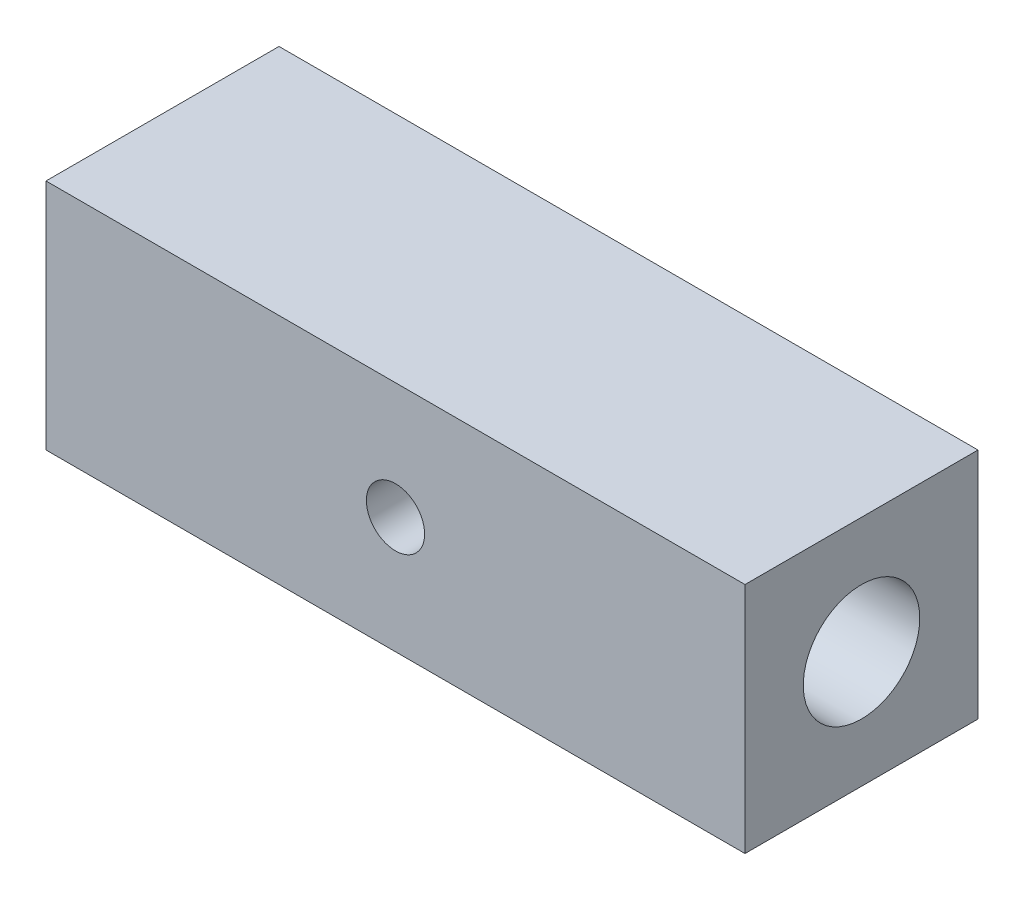
ISO-10303-21;
HEADER;
FILE_DESCRIPTION(('STEP AP214'),'2;1');
FILE_NAME('part.step','',(''),(''),'','','');
FILE_SCHEMA(('AUTOMOTIVE_DESIGN { 1 0 10303 214 1 1 1 1 }'));
ENDSEC;
DATA;
#1=APPLICATION_CONTEXT('core data for automotive mechanical design processes');
#2=APPLICATION_PROTOCOL_DEFINITION('international standard','automotive_design',2000,#1);
#3=PRODUCT_CONTEXT('',#1,'mechanical');
#4=PRODUCT('Part','Part','',(#3));
#5=PRODUCT_RELATED_PRODUCT_CATEGORY('part','',(#4));
#6=PRODUCT_DEFINITION_FORMATION('','',#4);
#7=PRODUCT_DEFINITION_CONTEXT('part definition',#1,'design');
#8=PRODUCT_DEFINITION('design','',#6,#7);
#9=PRODUCT_DEFINITION_SHAPE('','',#8);
#10=(LENGTH_UNIT() NAMED_UNIT(*) SI_UNIT(.MILLI.,.METRE.));
#11=(NAMED_UNIT(*) PLANE_ANGLE_UNIT() SI_UNIT($,.RADIAN.));
#12=(NAMED_UNIT(*) SI_UNIT($,.STERADIAN.) SOLID_ANGLE_UNIT());
#13=UNCERTAINTY_MEASURE_WITH_UNIT(LENGTH_MEASURE(1.E-05),#10,'distance_accuracy_value','');
#14=(GEOMETRIC_REPRESENTATION_CONTEXT(3) GLOBAL_UNCERTAINTY_ASSIGNED_CONTEXT((#13)) GLOBAL_UNIT_ASSIGNED_CONTEXT((#10,
#11,#12)) REPRESENTATION_CONTEXT('',''));
#15=CARTESIAN_POINT('',(0.,0.,0.));
#16=DIRECTION('',(0.,0.,1.));
#17=DIRECTION('',(1.,0.,0.));
#18=AXIS2_PLACEMENT_3D('',#15,#16,#17);
#19=CARTESIAN_POINT('',(-38.1,12.7,25.4));
#20=DIRECTION('',(0.,0.,-1.));
#21=DIRECTION('',(-1.,0.,0.));
#22=AXIS2_PLACEMENT_3D('',#19,#20,#21);
#23=CYLINDRICAL_SURFACE('',#22,3.175);
#24=CARTESIAN_POINT('',(-41.275,12.7,19.05));
#25=CARTESIAN_POINT('',(-41.2749991122824,12.6165030779405,19.0499993116644));
#26=CARTESIAN_POINT('',(-41.2717001255541,12.53299734442,19.048347589117));
#27=CARTESIAN_POINT('',(-41.2585541254501,12.3666216697412,19.0417910582171));
#28=CARTESIAN_POINT('',(-41.2487042634742,12.2837520210442,19.0368848346711));
#29=CARTESIAN_POINT('',(-41.209427934954,12.036817969353,19.0174242674832));
#30=CARTESIAN_POINT('',(-41.1702749225986,11.8745498532384,18.9981282729942));
#31=CARTESIAN_POINT('',(-41.0680092887059,11.5603487109957,18.9489182313574));
#32=CARTESIAN_POINT('',(-41.0049897807566,11.4083781918813,18.9190454778682));
#33=CARTESIAN_POINT('',(-40.8572639263711,11.1173596496212,18.8514281204164));
#34=CARTESIAN_POINT('',(-40.7725592898491,10.9783106087698,18.8136841371588));
#35=CARTESIAN_POINT('',(-40.5780303702658,10.7076589115183,18.7311109618298));
#36=CARTESIAN_POINT('',(-40.4669964222061,10.5770156609991,18.6859912727082));
#37=CARTESIAN_POINT('',(-40.2256033164272,10.3353293093015,18.5947053559106));
#38=CARTESIAN_POINT('',(-40.0952295702336,10.2243011439868,18.5485383606904));
#39=CARTESIAN_POINT('',(-39.8065790522467,10.0163115150211,18.4562363493446));
#40=CARTESIAN_POINT('',(-39.6469224686984,9.92110864838066,18.4103814617679));
#41=CARTESIAN_POINT('',(-39.3954520128256,9.79980650048466,18.3491975928636));
#42=CARTESIAN_POINT('',(-39.3095999381713,9.76294733883109,18.3300642080593));
#43=CARTESIAN_POINT('',(-39.1344143862936,9.69677491260394,18.2950460485327));
#44=CARTESIAN_POINT('',(-39.0450830018195,9.66745719027842,18.2791593558343));
#45=CARTESIAN_POINT('',(-38.8689894480353,9.61825736707018,18.2521261163505));
#46=CARTESIAN_POINT('',(-38.7823892059714,9.59791871888022,18.2407542913775));
#47=CARTESIAN_POINT('',(-38.6074127210056,9.56454399639235,18.2219365488644));
#48=CARTESIAN_POINT('',(-38.5190374462283,9.55150404762743,18.2144885485114));
#49=CARTESIAN_POINT('',(-38.3412932611514,9.5329228694656,18.2038387578292));
#50=CARTESIAN_POINT('',(-38.2519249820126,9.52737712400351,18.2006344102652));
#51=CARTESIAN_POINT('',(-38.0730192158219,9.52385221193007,18.1985978839861));
#52=CARTESIAN_POINT('',(-37.9834817457287,9.52587232340128,18.199765288128));
#53=CARTESIAN_POINT('',(-37.7372521242756,9.5418806966974,18.2089919036273));
#54=CARTESIAN_POINT('',(-37.5811582701866,9.56378746547035,18.2216085735771));
#55=CARTESIAN_POINT('',(-37.2753533586935,9.62996253627833,18.2586649305282));
#56=CARTESIAN_POINT('',(-37.1256443509773,9.67423796145496,18.2831083835808));
#57=CARTESIAN_POINT('',(-36.8324557034359,9.78468490166353,18.3415788540724));
#58=CARTESIAN_POINT('',(-36.6892023900634,9.85134241870582,18.3758158387613));
#59=CARTESIAN_POINT('',(-36.415233913826,10.0042923847395,18.4500326880763));
#60=CARTESIAN_POINT('',(-36.2845244203915,10.0905936532537,18.490015129278));
#61=CARTESIAN_POINT('',(-36.0218957257497,10.2931403575043,18.5773428901861));
#62=CARTESIAN_POINT('',(-35.8919246151435,10.4117951166475,18.6249789840394));
#63=CARTESIAN_POINT('',(-35.6529148571362,10.6694110155157,18.718137005749));
#64=CARTESIAN_POINT('',(-35.5438862136413,10.8083818043645,18.7636579153816));
#65=CARTESIAN_POINT('',(-35.3450980802803,11.1108601002752,18.8500381059768));
#66=CARTESIAN_POINT('',(-35.2564685144201,11.2752073483521,18.8905827497457));
#67=CARTESIAN_POINT('',(-35.1088419183647,11.6190197641442,18.9597627229995));
#68=CARTESIAN_POINT('',(-35.0498213588683,11.7984727949261,18.9884075057895));
#69=CARTESIAN_POINT('',(-34.967940596601,12.1514663893732,19.0285475969036));
#70=CARTESIAN_POINT('',(-34.9424903274127,12.3242656406148,19.04126679123));
#71=CARTESIAN_POINT('',(-34.9203494777398,12.6721247700552,19.0523181771632));
#72=CARTESIAN_POINT('',(-34.9236452728607,12.84718353806,19.0506571843613));
#73=CARTESIAN_POINT('',(-34.9574062359454,13.1801646860804,19.033845354084));
#74=CARTESIAN_POINT('',(-34.9857457914749,13.3383636205642,19.0197500506043));
#75=CARTESIAN_POINT('',(-35.0654558782099,13.647441883053,18.9808539392412));
#76=CARTESIAN_POINT('',(-35.1168289484773,13.7983204020714,18.9560519511351));
#77=CARTESIAN_POINT('',(-35.2424951309378,14.0934713318251,18.8970999823633));
#78=CARTESIAN_POINT('',(-35.3174015841112,14.2374315104782,18.8627029961072));
#79=CARTESIAN_POINT('',(-35.4873164256859,14.5112148234104,18.7878711846566));
#80=CARTESIAN_POINT('',(-35.5823333773854,14.6410318995993,18.7474337895468));
#81=CARTESIAN_POINT('',(-35.8005393503738,14.8963624134268,18.6597360270994));
#82=CARTESIAN_POINT('',(-35.9255786071116,15.0202013468198,18.612195592511));
#83=CARTESIAN_POINT('',(-36.1947623551498,15.2458938191887,18.5185809323137));
#84=CARTESIAN_POINT('',(-36.338919952381,15.3477321493525,18.4725077396355));
#85=CARTESIAN_POINT('',(-36.6510686019584,15.5311726287672,18.3848753528874));
#86=CARTESIAN_POINT('',(-36.8198757695104,15.6115559499801,18.3436428144182));
#87=CARTESIAN_POINT('',(-37.1713444648897,15.7419129715294,18.2744767953732));
#88=CARTESIAN_POINT('',(-37.3539877978474,15.7919258549222,18.2465261890087));
#89=CARTESIAN_POINT('',(-37.7091899564702,15.8555108603792,18.210577657146));
#90=CARTESIAN_POINT('',(-37.8810337504072,15.8721202730971,18.2009219234324));
#91=CARTESIAN_POINT('',(-38.2252444424952,15.8771880556388,18.1980000114536));
#92=CARTESIAN_POINT('',(-38.3976110815426,15.8656586276839,18.2047267290444));
#93=CARTESIAN_POINT('',(-38.7206601030739,15.8176154807366,18.2320521147778));
#94=CARTESIAN_POINT('',(-38.8718439417312,15.7835865120769,18.2512682307627));
#95=CARTESIAN_POINT('',(-39.1661908301672,15.6945816482881,18.2997797830258));
#96=CARTESIAN_POINT('',(-39.3093512828503,15.63959901506,18.3290784612733));
#97=CARTESIAN_POINT('',(-39.5942336994286,15.5061154442137,18.3968557633717));
#98=CARTESIAN_POINT('',(-39.7352128093657,15.4262826050393,18.4358188948053));
#99=CARTESIAN_POINT('',(-40.0026974317231,15.2468275915658,18.5177220708238));
#100=CARTESIAN_POINT('',(-40.1291953599427,15.1471951216993,18.5606641782013));
#101=CARTESIAN_POINT('',(-40.3800975241771,14.9168028766122,18.651927537612));
#102=CARTESIAN_POINT('',(-40.5023797564128,14.7837318855871,18.7002683987735));
#103=CARTESIAN_POINT('',(-40.7233978732331,14.4975126512524,18.7921234557675));
#104=CARTESIAN_POINT('',(-40.8221210659827,14.3443536545743,18.8356350432304));
#105=CARTESIAN_POINT('',(-40.9502802661971,14.1017871570449,18.8939107319024));
#106=CARTESIAN_POINT('',(-40.9898005836814,14.0184220003092,18.9122317327138));
#107=CARTESIAN_POINT('',(-41.0615994748237,13.8480770102167,18.945953634756));
#108=CARTESIAN_POINT('',(-41.0938816065344,13.7610989778631,18.961355970127));
#109=CARTESIAN_POINT('',(-41.150759345915,13.5843613228131,18.9887509711198));
#110=CARTESIAN_POINT('',(-41.1753717181381,13.4946082449706,19.0007510680948));
#111=CARTESIAN_POINT('',(-41.2166673895299,13.3129256615916,19.021009835719));
#112=CARTESIAN_POINT('',(-41.2333555321935,13.2209975216803,19.0292707916836));
#113=CARTESIAN_POINT('',(-41.2556162848624,13.0575313475244,19.0403250326333));
#114=CARTESIAN_POINT('',(-41.2628788212497,12.9862740464886,19.0439467081289));
#115=CARTESIAN_POINT('',(-41.2725711265376,12.8433466689413,19.0487845204557));
#116=CARTESIAN_POINT('',(-41.2750007620468,12.7716765810914,19.0500005908905));
#117=CARTESIAN_POINT('',(-41.275,12.7,19.05));
#118=B_SPLINE_CURVE_WITH_KNOTS('',3,(#24,#25,#26,#27,#28,#29,#30,#31,#32,#33,#34,#35,#36,#37,
#38,#39,#40,#41,#42,#43,#44,#45,#46,#47,#48,#49,#50,#51,#52,#53,#54,#55,#56,#57,#58,#59,#60,#61,
#62,#63,#64,#65,#66,#67,#68,#69,#70,#71,#72,#73,#74,#75,#76,#77,#78,#79,#80,#81,#82,#83,#84,#85,
#86,#87,#88,#89,#90,#91,#92,#93,#94,#95,#96,#97,#98,#99,#100,#101,#102,#103,#104,#105,#106,#107,
#108,#109,#110,#111,#112,#113,#114,#115,#116,#117),.UNSPECIFIED.,.T.,.F.,(4,2,2,2,2,2,2,2,2,2,2,
2,2,2,2,2,2,2,2,2,2,2,2,2,2,2,2,2,2,2,2,2,2,2,2,2,2,2,2,2,2,2,2,2,2,2,4),(0.,0.250415612102678,
0.500940186864014,1.00234854488129,1.50182051324263,2.00125310940106,2.53090025348452,
3.06094897410615,3.63210298373098,3.91787290005988,4.20347350732849,4.47213270490102,
4.74064915090148,5.00900371453886,5.27733267302575,5.74927594687738,6.22136960256845,
6.70445970327763,7.1877671279402,7.73235646527879,8.27720530143645,8.84735553323665,
9.41705196489303,9.93956405039338,10.4618285011675,10.9436138594975,11.4254523397102,
11.9210677568139,12.4168946391879,12.9614122158798,13.5063050164601,14.0775857365549,
14.6481278321882,15.1639000911419,15.6794487286237,16.1458838633213,16.6124691169503,
17.1104020806943,17.6085946442304,18.1673210354482,18.7263477502426,19.0082017078365,
19.2899168101042,19.5710117490933,19.8519346536844,20.0668939492147,20.2818591776892),.UNSPECIFIED.);
#119=CARTESIAN_POINT('',(-41.275,12.7,19.05));
#120=VERTEX_POINT('',#119);
#121=EDGE_CURVE('E36',#120,#120,#118,.T.);
#122=ORIENTED_EDGE('',*,*,#121,.F.);
#123=EDGE_LOOP('',(#122));
#124=FACE_BOUND('',#123,.T.);
#125=CARTESIAN_POINT('',(-38.1,12.7,25.4));
#126=DIRECTION('',(0.,0.,1.));
#127=DIRECTION('',(1.,0.,0.));
#128=AXIS2_PLACEMENT_3D('',#125,#126,#127);
#129=CIRCLE('',#128,3.175);
#130=CARTESIAN_POINT('',(-34.925,12.7,25.4));
#131=VERTEX_POINT('',#130);
#132=EDGE_CURVE('E107',#131,#131,#129,.T.);
#133=ORIENTED_EDGE('',*,*,#132,.T.);
#134=EDGE_LOOP('',(#133));
#135=FACE_BOUND('',#134,.T.);
#136=ADVANCED_FACE('F32',(#124,#135),#23,.F.);
#137=CARTESIAN_POINT('',(0.,0.,25.4));
#138=DIRECTION('',(0.,0.,1.));
#139=DIRECTION('',(1.,0.,0.));
#140=AXIS2_PLACEMENT_3D('',#137,#138,#139);
#141=PLANE('',#140);
#142=DIRECTION('',(0.,-1.,0.));
#143=VECTOR('',#142,1.);
#144=CARTESIAN_POINT('',(-76.2,25.4,25.4));
#145=LINE('',#144,#143);
#146=CARTESIAN_POINT('',(-76.2,25.4,25.4));
#147=VERTEX_POINT('',#146);
#148=CARTESIAN_POINT('',(-76.2,0.,25.4));
#149=VERTEX_POINT('',#148);
#150=EDGE_CURVE('E91',#147,#149,#145,.T.);
#151=ORIENTED_EDGE('',*,*,#150,.T.);
#152=DIRECTION('',(1.,0.,0.));
#153=VECTOR('',#152,1.);
#154=CARTESIAN_POINT('',(-76.2,0.,25.4));
#155=LINE('',#154,#153);
#156=CARTESIAN_POINT('',(0.,0.,25.4));
#157=VERTEX_POINT('',#156);
#158=EDGE_CURVE('E85',#149,#157,#155,.T.);
#159=ORIENTED_EDGE('',*,*,#158,.T.);
#160=DIRECTION('',(0.,1.,0.));
#161=VECTOR('',#160,1.);
#162=CARTESIAN_POINT('',(0.,25.4,25.4));
#163=LINE('',#162,#161);
#164=CARTESIAN_POINT('',(0.,25.4,25.4));
#165=VERTEX_POINT('',#164);
#166=EDGE_CURVE('E89',#157,#165,#163,.T.);
#167=ORIENTED_EDGE('',*,*,#166,.T.);
#168=DIRECTION('',(-1.,0.,0.));
#169=VECTOR('',#168,1.);
#170=CARTESIAN_POINT('',(-76.2,25.4,25.4));
#171=LINE('',#170,#169);
#172=EDGE_CURVE('E55',#165,#147,#171,.T.);
#173=ORIENTED_EDGE('',*,*,#172,.T.);
#174=EDGE_LOOP('',(#151,#159,#167,#173));
#175=FACE_BOUND('',#174,.T.);
#176=ORIENTED_EDGE('',*,*,#132,.F.);
#177=EDGE_LOOP('',(#176));
#178=FACE_BOUND('',#177,.T.);
#179=ADVANCED_FACE('F86',(#175,#178),#141,.T.);
#180=CARTESIAN_POINT('',(0.,0.,0.));
#181=DIRECTION('',(0.,0.,1.));
#182=DIRECTION('',(1.,0.,0.));
#183=AXIS2_PLACEMENT_3D('',#180,#181,#182);
#184=PLANE('',#183);
#185=DIRECTION('',(0.,-1.,0.));
#186=VECTOR('',#185,1.);
#187=CARTESIAN_POINT('',(-76.2,25.4,0.));
#188=LINE('',#187,#186);
#189=CARTESIAN_POINT('',(-76.2,25.4,0.));
#190=VERTEX_POINT('',#189);
#191=CARTESIAN_POINT('',(-76.2,0.,0.));
#192=VERTEX_POINT('',#191);
#193=EDGE_CURVE('E104',#190,#192,#188,.T.);
#194=ORIENTED_EDGE('',*,*,#193,.F.);
#195=DIRECTION('',(-1.,0.,0.));
#196=VECTOR('',#195,1.);
#197=CARTESIAN_POINT('',(-76.2,25.4,0.));
#198=LINE('',#197,#196);
#199=CARTESIAN_POINT('',(0.,25.4,0.));
#200=VERTEX_POINT('',#199);
#201=EDGE_CURVE('E78',#200,#190,#198,.T.);
#202=ORIENTED_EDGE('',*,*,#201,.F.);
#203=DIRECTION('',(0.,1.,0.));
#204=VECTOR('',#203,1.);
#205=CARTESIAN_POINT('',(0.,25.4,0.));
#206=LINE('',#205,#204);
#207=CARTESIAN_POINT('',(0.,0.,0.));
#208=VERTEX_POINT('',#207);
#209=EDGE_CURVE('E72',#208,#200,#206,.T.);
#210=ORIENTED_EDGE('',*,*,#209,.F.);
#211=DIRECTION('',(1.,0.,0.));
#212=VECTOR('',#211,1.);
#213=CARTESIAN_POINT('',(-76.2,0.,0.));
#214=LINE('',#213,#212);
#215=EDGE_CURVE('E95',#192,#208,#214,.T.);
#216=ORIENTED_EDGE('',*,*,#215,.F.);
#217=EDGE_LOOP('',(#194,#202,#210,#216));
#218=FACE_BOUND('',#217,.T.);
#219=CARTESIAN_POINT('',(-38.1,12.7,0.));
#220=DIRECTION('',(0.,0.,1.));
#221=DIRECTION('',(1.,0.,0.));
#222=AXIS2_PLACEMENT_3D('',#219,#220,#221);
#223=CIRCLE('',#222,3.175);
#224=CARTESIAN_POINT('',(-34.925,12.7,0.));
#225=VERTEX_POINT('',#224);
#226=EDGE_CURVE('E142',#225,#225,#223,.T.);
#227=ORIENTED_EDGE('',*,*,#226,.T.);
#228=EDGE_LOOP('',(#227));
#229=FACE_BOUND('',#228,.T.);
#230=ADVANCED_FACE('F137',(#218,#229),#184,.F.);
#231=CARTESIAN_POINT('',(-76.2,25.4,25.4));
#232=DIRECTION('',(1.,0.,0.));
#233=DIRECTION('',(0.,1.,0.));
#234=AXIS2_PLACEMENT_3D('',#231,#232,#233);
#235=PLANE('',#234);
#236=CARTESIAN_POINT('',(-76.2,12.7,12.7));
#237=DIRECTION('',(1.,0.,0.));
#238=DIRECTION('',(0.,0.,-1.));
#239=AXIS2_PLACEMENT_3D('',#236,#237,#238);
#240=CIRCLE('',#239,6.35);
#241=CARTESIAN_POINT('',(-76.2,12.7,6.35));
#242=VERTEX_POINT('',#241);
#243=EDGE_CURVE('E116',#242,#242,#240,.T.);
#244=ORIENTED_EDGE('',*,*,#243,.T.);
#245=EDGE_LOOP('',(#244));
#246=FACE_BOUND('',#245,.T.);
#247=ORIENTED_EDGE('',*,*,#193,.T.);
#248=DIRECTION('',(0.,0.,-1.));
#249=VECTOR('',#248,1.);
#250=CARTESIAN_POINT('',(-76.2,0.,25.4));
#251=LINE('',#250,#249);
#252=EDGE_CURVE('E11',#149,#192,#251,.T.);
#253=ORIENTED_EDGE('',*,*,#252,.F.);
#254=ORIENTED_EDGE('',*,*,#150,.F.);
#255=DIRECTION('',(0.,0.,-1.));
#256=VECTOR('',#255,1.);
#257=CARTESIAN_POINT('',(-76.2,25.4,25.4));
#258=LINE('',#257,#256);
#259=EDGE_CURVE('E100',#147,#190,#258,.T.);
#260=ORIENTED_EDGE('',*,*,#259,.T.);
#261=EDGE_LOOP('',(#247,#253,#254,#260));
#262=FACE_BOUND('',#261,.T.);
#263=ADVANCED_FACE('F34',(#246,#262),#235,.F.);
#264=CARTESIAN_POINT('',(-76.2,0.,25.4));
#265=DIRECTION('',(0.,1.,0.));
#266=DIRECTION('',(0.,0.,1.));
#267=AXIS2_PLACEMENT_3D('',#264,#265,#266);
#268=PLANE('',#267);
#269=ORIENTED_EDGE('',*,*,#215,.T.);
#270=DIRECTION('',(0.,0.,-1.));
#271=VECTOR('',#270,1.);
#272=CARTESIAN_POINT('',(0.,0.,25.4));
#273=LINE('',#272,#271);
#274=EDGE_CURVE('E46',#157,#208,#273,.T.);
#275=ORIENTED_EDGE('',*,*,#274,.F.);
#276=ORIENTED_EDGE('',*,*,#158,.F.);
#277=ORIENTED_EDGE('',*,*,#252,.T.);
#278=EDGE_LOOP('',(#269,#275,#276,#277));
#279=FACE_BOUND('',#278,.T.);
#280=ADVANCED_FACE('F94',(#279),#268,.F.);
#281=CARTESIAN_POINT('',(0.,25.4,25.4));
#282=DIRECTION('',(-1.,0.,0.));
#283=DIRECTION('',(0.,0.,1.));
#284=AXIS2_PLACEMENT_3D('',#281,#282,#283);
#285=PLANE('',#284);
#286=CARTESIAN_POINT('',(0.,12.7,12.7));
#287=DIRECTION('',(1.,0.,0.));
#288=DIRECTION('',(0.,0.,-1.));
#289=AXIS2_PLACEMENT_3D('',#286,#287,#288);
#290=CIRCLE('',#289,6.35);
#291=CARTESIAN_POINT('',(0.,12.7,6.35));
#292=VERTEX_POINT('',#291);
#293=EDGE_CURVE('E147',#292,#292,#290,.T.);
#294=ORIENTED_EDGE('',*,*,#293,.F.);
#295=EDGE_LOOP('',(#294));
#296=FACE_BOUND('',#295,.T.);
#297=ORIENTED_EDGE('',*,*,#209,.T.);
#298=DIRECTION('',(0.,0.,-1.));
#299=VECTOR('',#298,1.);
#300=CARTESIAN_POINT('',(0.,25.4,25.4));
#301=LINE('',#300,#299);
#302=EDGE_CURVE('E96',#165,#200,#301,.T.);
#303=ORIENTED_EDGE('',*,*,#302,.F.);
#304=ORIENTED_EDGE('',*,*,#166,.F.);
#305=ORIENTED_EDGE('',*,*,#274,.T.);
#306=EDGE_LOOP('',(#297,#303,#304,#305));
#307=FACE_BOUND('',#306,.T.);
#308=ADVANCED_FACE('F98',(#296,#307),#285,.F.);
#309=CARTESIAN_POINT('',(-76.2,25.4,25.4));
#310=DIRECTION('',(0.,-1.,0.));
#311=DIRECTION('',(0.,0.,-1.));
#312=AXIS2_PLACEMENT_3D('',#309,#310,#311);
#313=PLANE('',#312);
#314=ORIENTED_EDGE('',*,*,#201,.T.);
#315=ORIENTED_EDGE('',*,*,#259,.F.);
#316=ORIENTED_EDGE('',*,*,#172,.F.);
#317=ORIENTED_EDGE('',*,*,#302,.T.);
#318=EDGE_LOOP('',(#314,#315,#316,#317));
#319=FACE_BOUND('',#318,.T.);
#320=ADVANCED_FACE('F128',(#319),#313,.F.);
#321=CARTESIAN_POINT('',(-41.275,12.7,6.35));
#322=CARTESIAN_POINT('',(-41.2749991122824,12.7834969220595,6.35000068833556));
#323=CARTESIAN_POINT('',(-41.2717001255541,12.86700265558,6.35165241088299));
#324=CARTESIAN_POINT('',(-41.2585541254501,13.0333783302588,6.35820894178285));
#325=CARTESIAN_POINT('',(-41.2487042634742,13.1162479789558,6.36311516532887));
#326=CARTESIAN_POINT('',(-41.209427934954,13.363182030647,6.38257573251675));
#327=CARTESIAN_POINT('',(-41.1702749225986,13.5254501467616,6.40187172700575));
#328=CARTESIAN_POINT('',(-41.0680092887059,13.8396512890043,6.4510817686426));
#329=CARTESIAN_POINT('',(-41.0049897807566,13.9916218081187,6.48095452213175));
#330=CARTESIAN_POINT('',(-40.8572639263711,14.2826403503788,6.54857187958363));
#331=CARTESIAN_POINT('',(-40.7725592898491,14.4216893912302,6.58631586284123));
#332=CARTESIAN_POINT('',(-40.5780303702658,14.6923410884817,6.66888903817018));
#333=CARTESIAN_POINT('',(-40.4669964222061,14.8229843390009,6.71400872729182));
#334=CARTESIAN_POINT('',(-40.2256033164272,15.0646706906985,6.80529464408944));
#335=CARTESIAN_POINT('',(-40.0952295702336,15.1756988560132,6.85146163930957));
#336=CARTESIAN_POINT('',(-39.8065790522467,15.3836884849789,6.94376365065536));
#337=CARTESIAN_POINT('',(-39.6469224686984,15.4788913516193,6.98961853823212));
#338=CARTESIAN_POINT('',(-39.3954520128256,15.6001934995153,7.05080240713637));
#339=CARTESIAN_POINT('',(-39.3095999381713,15.6370526611689,7.06993579194067));
#340=CARTESIAN_POINT('',(-39.1344143862936,15.7032250873961,7.10495395146732));
#341=CARTESIAN_POINT('',(-39.0450830018195,15.7325428097216,7.12084064416571));
#342=CARTESIAN_POINT('',(-38.8689894480353,15.7817426329298,7.14787388364951));
#343=CARTESIAN_POINT('',(-38.7823892059715,15.8020812811198,7.15924570862254));
#344=CARTESIAN_POINT('',(-38.6074127210056,15.8354560036076,7.17806345113556));
#345=CARTESIAN_POINT('',(-38.5190374462283,15.8484959523726,7.18551145148865));
#346=CARTESIAN_POINT('',(-38.3412932611514,15.8670771305344,7.19616124217081));
#347=CARTESIAN_POINT('',(-38.2519249820126,15.8726228759965,7.19936558973478));
#348=CARTESIAN_POINT('',(-38.0730192158219,15.8761477880699,7.20140211601391));
#349=CARTESIAN_POINT('',(-37.9834817457287,15.8741276765987,7.20023471187201));
#350=CARTESIAN_POINT('',(-37.7372521242756,15.8581193033026,7.19100809637267));
#351=CARTESIAN_POINT('',(-37.5811582701866,15.8362125345296,7.17839142642293));
#352=CARTESIAN_POINT('',(-37.2753533586935,15.7700374637217,7.14133506947175));
#353=CARTESIAN_POINT('',(-37.1256443509772,15.725762038545,7.11689161641923));
#354=CARTESIAN_POINT('',(-36.8324557034359,15.6153150983365,7.05842114592763));
#355=CARTESIAN_POINT('',(-36.6892023900634,15.5486575812942,7.02418416123871));
#356=CARTESIAN_POINT('',(-36.415233913826,15.3957076152605,6.94996731192367));
#357=CARTESIAN_POINT('',(-36.2845244203915,15.3094063467463,6.90998487072196));
#358=CARTESIAN_POINT('',(-36.0218957257497,15.1068596424956,6.82265710981389));
#359=CARTESIAN_POINT('',(-35.8919246151435,14.9882048833525,6.77502101596064));
#360=CARTESIAN_POINT('',(-35.6529148571362,14.7305889844843,6.68186299425095));
#361=CARTESIAN_POINT('',(-35.5438862136413,14.5916181956355,6.63634208461842));
#362=CARTESIAN_POINT('',(-35.3450980802803,14.2891398997248,6.5499618940232));
#363=CARTESIAN_POINT('',(-35.2564685144201,14.1247926516479,6.50941725025428));
#364=CARTESIAN_POINT('',(-35.1088419183647,13.7809802358558,6.44023727700048));
#365=CARTESIAN_POINT('',(-35.0498213588683,13.6015272050739,6.41159249421054));
#366=CARTESIAN_POINT('',(-34.967940596601,13.2485336106268,6.37145240309642));
#367=CARTESIAN_POINT('',(-34.9424903274127,13.0757343593852,6.35873320877005));
#368=CARTESIAN_POINT('',(-34.9203494777398,12.7278752299448,6.34768182283675));
#369=CARTESIAN_POINT('',(-34.9236452728607,12.55281646194,6.34934281563871));
#370=CARTESIAN_POINT('',(-34.9574062359454,12.2198353139196,6.36615464591601));
#371=CARTESIAN_POINT('',(-34.9857457914749,12.0616363794358,6.38024994939569));
#372=CARTESIAN_POINT('',(-35.0654558782099,11.752558116947,6.41914606075879));
#373=CARTESIAN_POINT('',(-35.1168289484773,11.6016795979286,6.44394804886485));
#374=CARTESIAN_POINT('',(-35.2424951309378,11.3065286681749,6.50290001763666));
#375=CARTESIAN_POINT('',(-35.3174015841112,11.1625684895218,6.53729700389282));
#376=CARTESIAN_POINT('',(-35.4873164256859,10.8887851765896,6.61212881534335));
#377=CARTESIAN_POINT('',(-35.5823333773854,10.7589681004007,6.6525662104532));
#378=CARTESIAN_POINT('',(-35.8005393503738,10.5036375865732,6.74026397290061));
#379=CARTESIAN_POINT('',(-35.9255786071116,10.3797986531802,6.78780440748902));
#380=CARTESIAN_POINT('',(-36.1947623551498,10.1541061808113,6.88141906768632));
#381=CARTESIAN_POINT('',(-36.3389199523809,10.0522678506475,6.92749226036453));
#382=CARTESIAN_POINT('',(-36.6510686019584,9.86882737123284,7.01512464711258));
#383=CARTESIAN_POINT('',(-36.8198757695104,9.78844405001987,7.05635718558179));
#384=CARTESIAN_POINT('',(-37.1713444648897,9.65808702847062,7.1255232046268));
#385=CARTESIAN_POINT('',(-37.3539877978474,9.60807414507781,7.15347381099131));
#386=CARTESIAN_POINT('',(-37.7091899564702,9.54448913962083,7.18942234285397));
#387=CARTESIAN_POINT('',(-37.8810337504072,9.52787972690289,7.19907807656755));
#388=CARTESIAN_POINT('',(-38.2252444424952,9.52281194436124,7.20199998854642));
#389=CARTESIAN_POINT('',(-38.3976110815426,9.53434137231615,7.19527327095559));
#390=CARTESIAN_POINT('',(-38.7206601030739,9.58238451926342,7.16794788522216));
#391=CARTESIAN_POINT('',(-38.8718439417312,9.61641348792313,7.14873176923731));
#392=CARTESIAN_POINT('',(-39.1661908301672,9.70541835171193,7.10022021697418));
#393=CARTESIAN_POINT('',(-39.3093512828503,9.76040098494001,7.07092153872665));
#394=CARTESIAN_POINT('',(-39.5942336994286,9.8938845557863,7.00314423662826));
#395=CARTESIAN_POINT('',(-39.7352128093657,9.97371739496071,6.96418110519467));
#396=CARTESIAN_POINT('',(-40.0026974317231,10.1531724084342,6.88227792917618));
#397=CARTESIAN_POINT('',(-40.1291953599427,10.2528048783007,6.8393358217987));
#398=CARTESIAN_POINT('',(-40.3800975241771,10.4831971233878,6.74807246238797));
#399=CARTESIAN_POINT('',(-40.5023797564128,10.6162681144129,6.69973160122654));
#400=CARTESIAN_POINT('',(-40.7233978732331,10.9024873487476,6.6078765442325));
#401=CARTESIAN_POINT('',(-40.8221210659827,11.0556463454257,6.56436495676957));
#402=CARTESIAN_POINT('',(-40.9502802661971,11.2982128429551,6.50608926809757));
#403=CARTESIAN_POINT('',(-40.9898005836814,11.3815779996908,6.48776826728617));
#404=CARTESIAN_POINT('',(-41.0615994748237,11.5519229897833,6.45404636524396));
#405=CARTESIAN_POINT('',(-41.0938816065344,11.6389010221369,6.43864402987296));
#406=CARTESIAN_POINT('',(-41.150759345915,11.8156386771869,6.41124902888019));
#407=CARTESIAN_POINT('',(-41.1753717181381,11.9053917550294,6.39924893190522));
#408=CARTESIAN_POINT('',(-41.2166673895299,12.0870743384084,6.37899016428097));
#409=CARTESIAN_POINT('',(-41.2333555321935,12.1790024783197,6.3707292083164));
#410=CARTESIAN_POINT('',(-41.2556162848624,12.3424686524756,6.35967496736666));
#411=CARTESIAN_POINT('',(-41.2628788212497,12.4137259535114,6.35605329187111));
#412=CARTESIAN_POINT('',(-41.2725711265376,12.5566533310586,6.35121547954433));
#413=CARTESIAN_POINT('',(-41.2750007620468,12.6283234189086,6.34999940910948));
#414=CARTESIAN_POINT('',(-41.275,12.7,6.35));
#415=B_SPLINE_CURVE_WITH_KNOTS('',3,(#321,#322,#323,#324,#325,#326,#327,#328,#329,#330,#331,
#332,#333,#334,#335,#336,#337,#338,#339,#340,#341,#342,#343,#344,#345,#346,#347,#348,#349,#350,
#351,#352,#353,#354,#355,#356,#357,#358,#359,#360,#361,#362,#363,#364,#365,#366,#367,#368,#369,
#370,#371,#372,#373,#374,#375,#376,#377,#378,#379,#380,#381,#382,#383,#384,#385,#386,#387,#388,
#389,#390,#391,#392,#393,#394,#395,#396,#397,#398,#399,#400,#401,#402,#403,#404,#405,#406,#407,
#408,#409,#410,#411,#412,#413,#414),.UNSPECIFIED.,.T.,.F.,(4,2,2,2,2,2,2,2,2,2,2,2,2,2,2,2,2,2,
2,2,2,2,2,2,2,2,2,2,2,2,2,2,2,2,2,2,2,2,2,2,2,2,2,2,2,2,4),(0.,0.250415612102678,
0.500940186864013,1.00234854488129,1.50182051324263,2.00125310940106,2.53090025348452,
3.06094897410615,3.63210298373098,3.91787290005988,4.20347350732849,4.47213270490101,
4.74064915090146,5.00900371453885,5.27733267302575,5.74927594687738,6.22136960256845,
6.70445970327763,7.18776712794021,7.7323564652788,8.27720530143645,8.84735553323665,
9.41705196489303,9.93956405039338,10.4618285011675,10.9436138594975,11.4254523397102,
11.9210677568139,12.4168946391879,12.9614122158798,13.5063050164601,14.0775857365549,
14.6481278321882,15.1639000911419,15.6794487286237,16.1458838633213,16.6124691169503,
17.1104020806943,17.6085946442304,18.1673210354482,18.7263477502426,19.0082017078365,
19.2899168101042,19.5710117490933,19.8519346536844,20.0668939492147,20.2818591776892),.UNSPECIFIED.);
#416=CARTESIAN_POINT('',(-41.275,12.7,6.35));
#417=VERTEX_POINT('',#416);
#418=EDGE_CURVE('E112',#417,#417,#415,.T.);
#419=ORIENTED_EDGE('',*,*,#418,.F.);
#420=EDGE_LOOP('',(#419));
#421=FACE_BOUND('',#420,.T.);
#422=ORIENTED_EDGE('',*,*,#226,.F.);
#423=EDGE_LOOP('',(#422));
#424=FACE_BOUND('',#423,.T.);
#425=ADVANCED_FACE('F117',(#421,#424),#23,.F.);
#426=CARTESIAN_POINT('',(-76.2,12.7,12.7));
#427=DIRECTION('',(1.,0.,0.));
#428=DIRECTION('',(0.,0.,-1.));
#429=AXIS2_PLACEMENT_3D('',#426,#427,#428);
#430=CYLINDRICAL_SURFACE('',#429,6.35);
#431=ORIENTED_EDGE('',*,*,#121,.T.);
#432=EDGE_LOOP('',(#431));
#433=FACE_BOUND('',#432,.T.);
#434=ORIENTED_EDGE('',*,*,#418,.T.);
#435=EDGE_LOOP('',(#434));
#436=FACE_BOUND('',#435,.T.);
#437=ORIENTED_EDGE('',*,*,#243,.F.);
#438=EDGE_LOOP('',(#437));
#439=FACE_BOUND('',#438,.T.);
#440=ORIENTED_EDGE('',*,*,#293,.T.);
#441=EDGE_LOOP('',(#440));
#442=FACE_BOUND('',#441,.T.);
#443=ADVANCED_FACE('F120',(#433,#436,#439,#442),#430,.F.);
#444=CLOSED_SHELL('',(#136,#179,#230,#263,#280,#308,#320,#425,#443));
#445=MANIFOLD_SOLID_BREP('B2',#444);
#446=ADVANCED_BREP_SHAPE_REPRESENTATION('',(#18,#445),#14);
#447=SHAPE_DEFINITION_REPRESENTATION(#9,#446);
ENDSEC;
END-ISO-10303-21;
